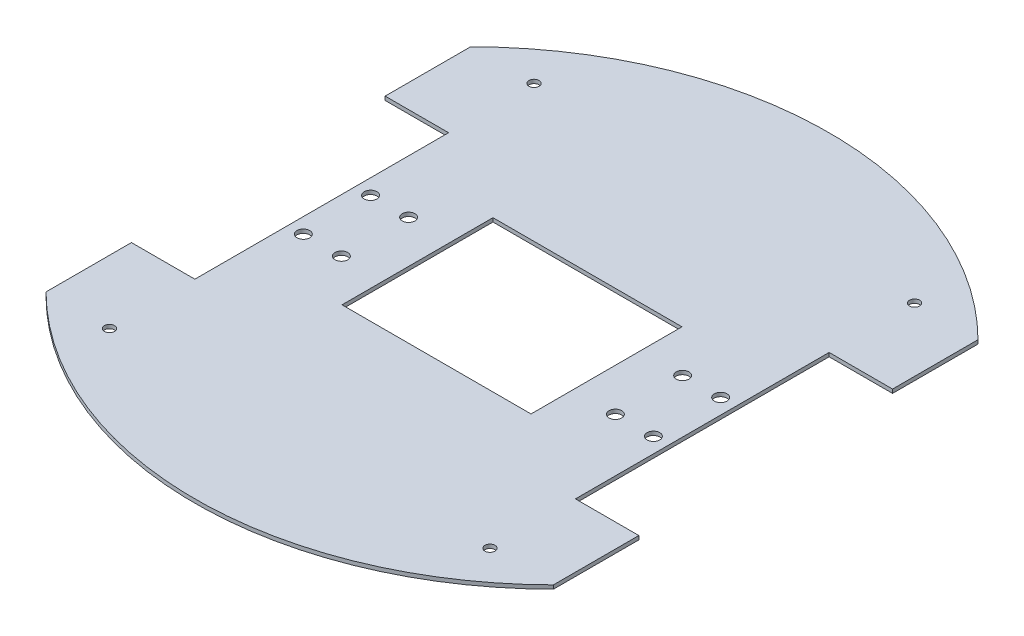
ISO-10303-21;
HEADER;
FILE_DESCRIPTION(('STEP AP214'),'2;1');
FILE_NAME('part.step','',(''),(''),'','','');
FILE_SCHEMA(('AUTOMOTIVE_DESIGN { 1 0 10303 214 1 1 1 1 }'));
ENDSEC;
DATA;
#1=APPLICATION_CONTEXT('core data for automotive mechanical design processes');
#2=APPLICATION_PROTOCOL_DEFINITION('international standard','automotive_design',2000,#1);
#3=PRODUCT_CONTEXT('',#1,'mechanical');
#4=PRODUCT('Part','Part','',(#3));
#5=PRODUCT_RELATED_PRODUCT_CATEGORY('part','',(#4));
#6=PRODUCT_DEFINITION_FORMATION('','',#4);
#7=PRODUCT_DEFINITION_CONTEXT('part definition',#1,'design');
#8=PRODUCT_DEFINITION('design','',#6,#7);
#9=PRODUCT_DEFINITION_SHAPE('','',#8);
#10=(LENGTH_UNIT() NAMED_UNIT(*) SI_UNIT(.MILLI.,.METRE.));
#11=(NAMED_UNIT(*) PLANE_ANGLE_UNIT() SI_UNIT($,.RADIAN.));
#12=(NAMED_UNIT(*) SI_UNIT($,.STERADIAN.) SOLID_ANGLE_UNIT());
#13=UNCERTAINTY_MEASURE_WITH_UNIT(LENGTH_MEASURE(1.E-05),#10,'distance_accuracy_value','');
#14=(GEOMETRIC_REPRESENTATION_CONTEXT(3) GLOBAL_UNCERTAINTY_ASSIGNED_CONTEXT((#13)) GLOBAL_UNIT_ASSIGNED_CONTEXT((#10,
#11,#12)) REPRESENTATION_CONTEXT('',''));
#15=CARTESIAN_POINT('',(0.,0.,0.));
#16=DIRECTION('',(0.,0.,1.));
#17=DIRECTION('',(1.,0.,0.));
#18=AXIS2_PLACEMENT_3D('',#15,#16,#17);
#19=CARTESIAN_POINT('',(0.,3.,-33.3333333333335));
#20=DIRECTION('',(0.,1.,0.));
#21=DIRECTION('',(0.,0.,1.));
#22=AXIS2_PLACEMENT_3D('',#19,#20,#21);
#23=PLANE('',#22);
#24=CARTESIAN_POINT('',(-138.,3.,-26.5));
#25=DIRECTION('',(0.,1.,0.));
#26=DIRECTION('',(0.,0.,1.));
#27=AXIS2_PLACEMENT_3D('',#24,#25,#26);
#28=CIRCLE('',#27,4.99999999999999);
#29=CARTESIAN_POINT('',(-138.,3.,-21.5));
#30=VERTEX_POINT('',#29);
#31=EDGE_CURVE('E426',#30,#30,#28,.F.);
#32=ORIENTED_EDGE('',*,*,#31,.T.);
#33=EDGE_LOOP('',(#32));
#34=FACE_BOUND('',#33,.T.);
#35=CARTESIAN_POINT('',(138.,3.,26.5000000000001));
#36=DIRECTION('',(0.,1.,0.));
#37=DIRECTION('',(0.,0.,1.));
#38=AXIS2_PLACEMENT_3D('',#35,#36,#37);
#39=CIRCLE('',#38,4.99999999999999);
#40=CARTESIAN_POINT('',(138.,3.,31.5000000000001));
#41=VERTEX_POINT('',#40);
#42=EDGE_CURVE('E434',#41,#41,#39,.F.);
#43=ORIENTED_EDGE('',*,*,#42,.T.);
#44=EDGE_LOOP('',(#43));
#45=FACE_BOUND('',#44,.T.);
#46=CARTESIAN_POINT('',(-138.,3.,26.5));
#47=DIRECTION('',(0.,1.,0.));
#48=DIRECTION('',(0.,0.,1.));
#49=AXIS2_PLACEMENT_3D('',#46,#47,#48);
#50=CIRCLE('',#49,4.99999999999999);
#51=CARTESIAN_POINT('',(-138.,3.,31.5));
#52=VERTEX_POINT('',#51);
#53=EDGE_CURVE('E437',#52,#52,#50,.T.);
#54=ORIENTED_EDGE('',*,*,#53,.F.);
#55=EDGE_LOOP('',(#54));
#56=FACE_BOUND('',#55,.T.);
#57=DIRECTION('',(0.,0.,1.));
#58=VECTOR('',#57,1.);
#59=CARTESIAN_POINT('',(-74.5,3.,-33.3333333333335));
#60=LINE('',#59,#58);
#61=CARTESIAN_POINT('',(-74.5,3.,-59.5));
#62=VERTEX_POINT('',#61);
#63=CARTESIAN_POINT('',(-74.5,3.,59.5));
#64=VERTEX_POINT('',#63);
#65=EDGE_CURVE('E186',#62,#64,#60,.T.);
#66=ORIENTED_EDGE('',*,*,#65,.F.);
#67=DIRECTION('',(-1.,0.,0.));
#68=VECTOR('',#67,1.);
#69=CARTESIAN_POINT('',(0.,3.,-59.5));
#70=LINE('',#69,#68);
#71=CARTESIAN_POINT('',(74.5,3.,-59.5));
#72=VERTEX_POINT('',#71);
#73=EDGE_CURVE('E179',#72,#62,#70,.T.);
#74=ORIENTED_EDGE('',*,*,#73,.F.);
#75=DIRECTION('',(0.,0.,-1.));
#76=VECTOR('',#75,1.);
#77=CARTESIAN_POINT('',(74.5,3.,-33.3333333333335));
#78=LINE('',#77,#76);
#79=CARTESIAN_POINT('',(74.5,3.,59.5));
#80=VERTEX_POINT('',#79);
#81=EDGE_CURVE('E159',#80,#72,#78,.T.);
#82=ORIENTED_EDGE('',*,*,#81,.F.);
#83=DIRECTION('',(1.,0.,0.));
#84=VECTOR('',#83,1.);
#85=CARTESIAN_POINT('',(0.,3.,59.5));
#86=LINE('',#85,#84);
#87=EDGE_CURVE('E184',#64,#80,#86,.T.);
#88=ORIENTED_EDGE('',*,*,#87,.F.);
#89=EDGE_LOOP('',(#66,#74,#82,#88));
#90=FACE_BOUND('',#89,.T.);
#91=CARTESIAN_POINT('',(-150.,3.,167.359909646538));
#92=DIRECTION('',(0.,1.,0.));
#93=DIRECTION('',(0.,0.,-1.));
#94=AXIS2_PLACEMENT_3D('',#91,#92,#93);
#95=CIRCLE('',#94,3.99999999999999);
#96=CARTESIAN_POINT('',(-150.,3.,163.359909646538));
#97=VERTEX_POINT('',#96);
#98=EDGE_CURVE('E188',#97,#97,#95,.T.);
#99=ORIENTED_EDGE('',*,*,#98,.F.);
#100=EDGE_LOOP('',(#99));
#101=FACE_BOUND('',#100,.T.);
#102=CARTESIAN_POINT('',(150.,3.,167.359909646538));
#103=DIRECTION('',(0.,1.,0.));
#104=DIRECTION('',(0.,0.,1.));
#105=AXIS2_PLACEMENT_3D('',#102,#103,#104);
#106=CIRCLE('',#105,3.99999999999999);
#107=CARTESIAN_POINT('',(150.,3.,171.359909646538));
#108=VERTEX_POINT('',#107);
#109=EDGE_CURVE('E193',#108,#108,#106,.T.);
#110=ORIENTED_EDGE('',*,*,#109,.F.);
#111=EDGE_LOOP('',(#110));
#112=FACE_BOUND('',#111,.T.);
#113=CARTESIAN_POINT('',(150.,3.,-167.359909646538));
#114=DIRECTION('',(0.,1.,0.));
#115=DIRECTION('',(0.,0.,-1.));
#116=AXIS2_PLACEMENT_3D('',#113,#114,#115);
#117=CIRCLE('',#116,3.99999999999999);
#118=CARTESIAN_POINT('',(150.,3.,-171.359909646538));
#119=VERTEX_POINT('',#118);
#120=EDGE_CURVE('E189',#119,#119,#117,.T.);
#121=ORIENTED_EDGE('',*,*,#120,.F.);
#122=EDGE_LOOP('',(#121));
#123=FACE_BOUND('',#122,.T.);
#124=CARTESIAN_POINT('',(-150.,3.,-167.359909646538));
#125=DIRECTION('',(0.,1.,0.));
#126=DIRECTION('',(0.,0.,1.));
#127=AXIS2_PLACEMENT_3D('',#124,#125,#126);
#128=CIRCLE('',#127,3.99999999999999);
#129=CARTESIAN_POINT('',(-150.,3.,-163.359909646538));
#130=VERTEX_POINT('',#129);
#131=EDGE_CURVE('E192',#130,#130,#128,.T.);
#132=ORIENTED_EDGE('',*,*,#131,.F.);
#133=EDGE_LOOP('',(#132));
#134=FACE_BOUND('',#133,.T.);
#135=DIRECTION('',(-1.,0.,0.));
#136=VECTOR('',#135,1.);
#137=CARTESIAN_POINT('',(-150.,3.,100.));
#138=LINE('',#137,#136);
#139=CARTESIAN_POINT('',(-150.,3.,100.));
#140=VERTEX_POINT('',#139);
#141=CARTESIAN_POINT('',(-200.,3.,100.));
#142=VERTEX_POINT('',#141);
#143=EDGE_CURVE('E201',#140,#142,#138,.T.);
#144=ORIENTED_EDGE('',*,*,#143,.T.);
#145=DIRECTION('',(0.,0.,1.));
#146=VECTOR('',#145,1.);
#147=CARTESIAN_POINT('',(-200.,3.,100.));
#148=LINE('',#147,#146);
#149=CARTESIAN_POINT('',(-200.,3.,167.359909646538));
#150=VERTEX_POINT('',#149);
#151=EDGE_CURVE('E204',#142,#150,#148,.T.);
#152=ORIENTED_EDGE('',*,*,#151,.T.);
#153=CARTESIAN_POINT('',(0.,3.,-33.3333333333335));
#154=DIRECTION('',(0.,1.,0.));
#155=DIRECTION('',(0.,0.,1.));
#156=AXIS2_PLACEMENT_3D('',#153,#154,#155);
#157=CIRCLE('',#156,283.333333333333);
#158=CARTESIAN_POINT('',(200.,3.,167.359909646538));
#159=VERTEX_POINT('',#158);
#160=EDGE_CURVE('E207',#150,#159,#157,.T.);
#161=ORIENTED_EDGE('',*,*,#160,.T.);
#162=DIRECTION('',(0.,0.,-1.));
#163=VECTOR('',#162,1.);
#164=CARTESIAN_POINT('',(200.,3.,100.));
#165=LINE('',#164,#163);
#166=CARTESIAN_POINT('',(200.,3.,100.));
#167=VERTEX_POINT('',#166);
#168=EDGE_CURVE('E209',#159,#167,#165,.T.);
#169=ORIENTED_EDGE('',*,*,#168,.T.);
#170=DIRECTION('',(-1.,0.,0.));
#171=VECTOR('',#170,1.);
#172=CARTESIAN_POINT('',(150.,3.,100.));
#173=LINE('',#172,#171);
#174=CARTESIAN_POINT('',(150.,3.,100.));
#175=VERTEX_POINT('',#174);
#176=EDGE_CURVE('E211',#167,#175,#173,.T.);
#177=ORIENTED_EDGE('',*,*,#176,.T.);
#178=DIRECTION('',(0.,0.,-1.));
#179=VECTOR('',#178,1.);
#180=CARTESIAN_POINT('',(150.,3.,100.));
#181=LINE('',#180,#179);
#182=CARTESIAN_POINT('',(150.,3.,-100.));
#183=VERTEX_POINT('',#182);
#184=EDGE_CURVE('E213',#175,#183,#181,.T.);
#185=ORIENTED_EDGE('',*,*,#184,.T.);
#186=DIRECTION('',(1.,0.,0.));
#187=VECTOR('',#186,1.);
#188=CARTESIAN_POINT('',(150.,3.,-100.));
#189=LINE('',#188,#187);
#190=CARTESIAN_POINT('',(200.,3.,-100.));
#191=VERTEX_POINT('',#190);
#192=EDGE_CURVE('E215',#183,#191,#189,.T.);
#193=ORIENTED_EDGE('',*,*,#192,.T.);
#194=DIRECTION('',(0.,0.,-1.));
#195=VECTOR('',#194,1.);
#196=CARTESIAN_POINT('',(200.,3.,-100.));
#197=LINE('',#196,#195);
#198=CARTESIAN_POINT('',(200.,3.,-167.359909646538));
#199=VERTEX_POINT('',#198);
#200=EDGE_CURVE('E217',#191,#199,#197,.T.);
#201=ORIENTED_EDGE('',*,*,#200,.T.);
#202=CARTESIAN_POINT('',(0.,3.,33.3333333333337));
#203=DIRECTION('',(0.,1.,0.));
#204=DIRECTION('',(0.,0.,-1.));
#205=AXIS2_PLACEMENT_3D('',#202,#203,#204);
#206=CIRCLE('',#205,283.333333333333);
#207=CARTESIAN_POINT('',(-200.,3.,-167.359909646538));
#208=VERTEX_POINT('',#207);
#209=EDGE_CURVE('E219',#199,#208,#206,.T.);
#210=ORIENTED_EDGE('',*,*,#209,.T.);
#211=DIRECTION('',(0.,0.,1.));
#212=VECTOR('',#211,1.);
#213=CARTESIAN_POINT('',(-200.,3.,-100.));
#214=LINE('',#213,#212);
#215=CARTESIAN_POINT('',(-200.,3.,-100.));
#216=VERTEX_POINT('',#215);
#217=EDGE_CURVE('E221',#208,#216,#214,.T.);
#218=ORIENTED_EDGE('',*,*,#217,.T.);
#219=DIRECTION('',(1.,0.,0.));
#220=VECTOR('',#219,1.);
#221=CARTESIAN_POINT('',(-150.,3.,-100.));
#222=LINE('',#221,#220);
#223=CARTESIAN_POINT('',(-150.,3.,-100.));
#224=VERTEX_POINT('',#223);
#225=EDGE_CURVE('E223',#216,#224,#222,.T.);
#226=ORIENTED_EDGE('',*,*,#225,.T.);
#227=DIRECTION('',(0.,0.,1.));
#228=VECTOR('',#227,1.);
#229=CARTESIAN_POINT('',(-150.,3.,-100.));
#230=LINE('',#229,#228);
#231=EDGE_CURVE('E225',#224,#140,#230,.T.);
#232=ORIENTED_EDGE('',*,*,#231,.T.);
#233=EDGE_LOOP('',(#144,#152,#161,#169,#177,#185,#193,#201,#210,#218,#226,#232));
#234=FACE_BOUND('',#233,.T.);
#235=CARTESIAN_POINT('',(138.,3.,-26.5));
#236=DIRECTION('',(0.,1.,0.));
#237=DIRECTION('',(0.,0.,1.));
#238=AXIS2_PLACEMENT_3D('',#235,#236,#237);
#239=CIRCLE('',#238,4.99999999999999);
#240=CARTESIAN_POINT('',(138.,3.,-21.5));
#241=VERTEX_POINT('',#240);
#242=EDGE_CURVE('E409',#241,#241,#239,.T.);
#243=ORIENTED_EDGE('',*,*,#242,.F.);
#244=EDGE_LOOP('',(#243));
#245=FACE_BOUND('',#244,.T.);
#246=CARTESIAN_POINT('',(108.,3.,-26.5));
#247=DIRECTION('',(0.,1.,0.));
#248=DIRECTION('',(0.,0.,1.));
#249=AXIS2_PLACEMENT_3D('',#246,#247,#248);
#250=CIRCLE('',#249,5.);
#251=CARTESIAN_POINT('',(108.,3.,-21.5));
#252=VERTEX_POINT('',#251);
#253=EDGE_CURVE('E413',#252,#252,#250,.T.);
#254=ORIENTED_EDGE('',*,*,#253,.F.);
#255=EDGE_LOOP('',(#254));
#256=FACE_BOUND('',#255,.T.);
#257=CARTESIAN_POINT('',(-108.,3.,26.5));
#258=DIRECTION('',(0.,1.,0.));
#259=DIRECTION('',(0.,0.,1.));
#260=AXIS2_PLACEMENT_3D('',#257,#258,#259);
#261=CIRCLE('',#260,5.);
#262=CARTESIAN_POINT('',(-108.,3.,31.5));
#263=VERTEX_POINT('',#262);
#264=EDGE_CURVE('E417',#263,#263,#261,.T.);
#265=ORIENTED_EDGE('',*,*,#264,.F.);
#266=EDGE_LOOP('',(#265));
#267=FACE_BOUND('',#266,.T.);
#268=CARTESIAN_POINT('',(-108.,3.,-26.5));
#269=DIRECTION('',(0.,1.,0.));
#270=DIRECTION('',(0.,0.,1.));
#271=AXIS2_PLACEMENT_3D('',#268,#269,#270);
#272=CIRCLE('',#271,5.);
#273=CARTESIAN_POINT('',(-108.,3.,-21.5));
#274=VERTEX_POINT('',#273);
#275=EDGE_CURVE('E421',#274,#274,#272,.F.);
#276=ORIENTED_EDGE('',*,*,#275,.T.);
#277=EDGE_LOOP('',(#276));
#278=FACE_BOUND('',#277,.T.);
#279=CARTESIAN_POINT('',(108.,3.,26.5000000000001));
#280=DIRECTION('',(0.,1.,0.));
#281=DIRECTION('',(0.,0.,1.));
#282=AXIS2_PLACEMENT_3D('',#279,#280,#281);
#283=CIRCLE('',#282,5.);
#284=CARTESIAN_POINT('',(108.,3.,31.5000000000001));
#285=VERTEX_POINT('',#284);
#286=EDGE_CURVE('E424',#285,#285,#283,.F.);
#287=ORIENTED_EDGE('',*,*,#286,.T.);
#288=EDGE_LOOP('',(#287));
#289=FACE_BOUND('',#288,.T.);
#290=ADVANCED_FACE('F38',(#34,#45,#56,#90,#101,#112,#123,#134,#234,#245,#256,#267,#278,#289),
#23,.T.);
#291=CARTESIAN_POINT('',(0.,0.,-33.3333333333335));
#292=DIRECTION('',(0.,1.,0.));
#293=DIRECTION('',(0.,0.,1.));
#294=AXIS2_PLACEMENT_3D('',#291,#292,#293);
#295=PLANE('',#294);
#296=CARTESIAN_POINT('',(-108.,0.,26.5));
#297=DIRECTION('',(0.,-1.,0.));
#298=DIRECTION('',(0.,0.,-1.));
#299=AXIS2_PLACEMENT_3D('',#296,#297,#298);
#300=CIRCLE('',#299,5.);
#301=CARTESIAN_POINT('',(-108.,0.,21.5));
#302=VERTEX_POINT('',#301);
#303=EDGE_CURVE('E443',#302,#302,#300,.T.);
#304=ORIENTED_EDGE('',*,*,#303,.F.);
#305=EDGE_LOOP('',(#304));
#306=FACE_BOUND('',#305,.T.);
#307=CARTESIAN_POINT('',(108.,0.,-26.5));
#308=DIRECTION('',(0.,-1.,0.));
#309=DIRECTION('',(0.,0.,-1.));
#310=AXIS2_PLACEMENT_3D('',#307,#308,#309);
#311=CIRCLE('',#310,5.);
#312=CARTESIAN_POINT('',(108.,0.,-31.5));
#313=VERTEX_POINT('',#312);
#314=EDGE_CURVE('E453',#313,#313,#311,.T.);
#315=ORIENTED_EDGE('',*,*,#314,.F.);
#316=EDGE_LOOP('',(#315));
#317=FACE_BOUND('',#316,.T.);
#318=CARTESIAN_POINT('',(138.,0.,-26.5));
#319=DIRECTION('',(0.,-1.,0.));
#320=DIRECTION('',(0.,0.,-1.));
#321=AXIS2_PLACEMENT_3D('',#318,#319,#320);
#322=CIRCLE('',#321,4.99999999999999);
#323=CARTESIAN_POINT('',(138.,0.,-31.5));
#324=VERTEX_POINT('',#323);
#325=EDGE_CURVE('E459',#324,#324,#322,.T.);
#326=ORIENTED_EDGE('',*,*,#325,.F.);
#327=EDGE_LOOP('',(#326));
#328=FACE_BOUND('',#327,.T.);
#329=CARTESIAN_POINT('',(-138.,0.,26.5));
#330=DIRECTION('',(0.,-1.,0.));
#331=DIRECTION('',(0.,0.,-1.));
#332=AXIS2_PLACEMENT_3D('',#329,#330,#331);
#333=CIRCLE('',#332,4.99999999999999);
#334=CARTESIAN_POINT('',(-138.,0.,21.5));
#335=VERTEX_POINT('',#334);
#336=EDGE_CURVE('E440',#335,#335,#333,.T.);
#337=ORIENTED_EDGE('',*,*,#336,.F.);
#338=EDGE_LOOP('',(#337));
#339=FACE_BOUND('',#338,.T.);
#340=DIRECTION('',(1.,0.,0.));
#341=VECTOR('',#340,1.);
#342=CARTESIAN_POINT('',(74.5,0.,-59.5));
#343=LINE('',#342,#341);
#344=CARTESIAN_POINT('',(-74.5,0.,-59.5));
#345=VERTEX_POINT('',#344);
#346=CARTESIAN_POINT('',(74.5,0.,-59.5));
#347=VERTEX_POINT('',#346);
#348=EDGE_CURVE('E165',#345,#347,#343,.T.);
#349=ORIENTED_EDGE('',*,*,#348,.F.);
#350=DIRECTION('',(0.,0.,-1.));
#351=VECTOR('',#350,1.);
#352=CARTESIAN_POINT('',(-74.5,0.,-59.5));
#353=LINE('',#352,#351);
#354=CARTESIAN_POINT('',(-74.5,0.,59.5));
#355=VERTEX_POINT('',#354);
#356=EDGE_CURVE('E63',#355,#345,#353,.T.);
#357=ORIENTED_EDGE('',*,*,#356,.F.);
#358=DIRECTION('',(-1.,0.,0.));
#359=VECTOR('',#358,1.);
#360=CARTESIAN_POINT('',(74.5,0.,59.5));
#361=LINE('',#360,#359);
#362=CARTESIAN_POINT('',(74.5,0.,59.5));
#363=VERTEX_POINT('',#362);
#364=EDGE_CURVE('E172',#363,#355,#361,.T.);
#365=ORIENTED_EDGE('',*,*,#364,.F.);
#366=DIRECTION('',(0.,0.,1.));
#367=VECTOR('',#366,1.);
#368=CARTESIAN_POINT('',(74.5,0.,-59.5));
#369=LINE('',#368,#367);
#370=EDGE_CURVE('E156',#347,#363,#369,.T.);
#371=ORIENTED_EDGE('',*,*,#370,.F.);
#372=EDGE_LOOP('',(#349,#357,#365,#371));
#373=FACE_BOUND('',#372,.T.);
#374=CARTESIAN_POINT('',(-150.,0.,167.359909646538));
#375=DIRECTION('',(0.,1.,0.));
#376=DIRECTION('',(0.,0.,1.));
#377=AXIS2_PLACEMENT_3D('',#374,#375,#376);
#378=CIRCLE('',#377,3.99999999999999);
#379=CARTESIAN_POINT('',(-150.,0.,171.359909646538));
#380=VERTEX_POINT('',#379);
#381=EDGE_CURVE('E42',#380,#380,#378,.T.);
#382=ORIENTED_EDGE('',*,*,#381,.T.);
#383=EDGE_LOOP('',(#382));
#384=FACE_BOUND('',#383,.T.);
#385=CARTESIAN_POINT('',(150.,0.,167.359909646538));
#386=DIRECTION('',(0.,1.,0.));
#387=DIRECTION('',(0.,0.,1.));
#388=AXIS2_PLACEMENT_3D('',#385,#386,#387);
#389=CIRCLE('',#388,3.99999999999999);
#390=CARTESIAN_POINT('',(150.,0.,171.359909646538));
#391=VERTEX_POINT('',#390);
#392=EDGE_CURVE('E287',#391,#391,#389,.T.);
#393=ORIENTED_EDGE('',*,*,#392,.T.);
#394=EDGE_LOOP('',(#393));
#395=FACE_BOUND('',#394,.T.);
#396=CARTESIAN_POINT('',(150.,0.,-167.359909646538));
#397=DIRECTION('',(0.,1.,0.));
#398=DIRECTION('',(0.,0.,1.));
#399=AXIS2_PLACEMENT_3D('',#396,#397,#398);
#400=CIRCLE('',#399,3.99999999999999);
#401=CARTESIAN_POINT('',(150.,0.,-163.359909646538));
#402=VERTEX_POINT('',#401);
#403=EDGE_CURVE('E285',#402,#402,#400,.T.);
#404=ORIENTED_EDGE('',*,*,#403,.T.);
#405=EDGE_LOOP('',(#404));
#406=FACE_BOUND('',#405,.T.);
#407=CARTESIAN_POINT('',(-150.,0.,-167.359909646538));
#408=DIRECTION('',(0.,1.,0.));
#409=DIRECTION('',(0.,0.,1.));
#410=AXIS2_PLACEMENT_3D('',#407,#408,#409);
#411=CIRCLE('',#410,3.99999999999999);
#412=CARTESIAN_POINT('',(-150.,0.,-163.359909646538));
#413=VERTEX_POINT('',#412);
#414=EDGE_CURVE('E200',#413,#413,#411,.T.);
#415=ORIENTED_EDGE('',*,*,#414,.T.);
#416=EDGE_LOOP('',(#415));
#417=FACE_BOUND('',#416,.T.);
#418=DIRECTION('',(-1.,0.,0.));
#419=VECTOR('',#418,1.);
#420=CARTESIAN_POINT('',(-150.,0.,100.));
#421=LINE('',#420,#419);
#422=CARTESIAN_POINT('',(-150.,0.,100.));
#423=VERTEX_POINT('',#422);
#424=CARTESIAN_POINT('',(-200.,0.,100.));
#425=VERTEX_POINT('',#424);
#426=EDGE_CURVE('E228',#423,#425,#421,.T.);
#427=ORIENTED_EDGE('',*,*,#426,.F.);
#428=DIRECTION('',(0.,0.,1.));
#429=VECTOR('',#428,1.);
#430=CARTESIAN_POINT('',(-150.,0.,-100.));
#431=LINE('',#430,#429);
#432=CARTESIAN_POINT('',(-150.,0.,-100.));
#433=VERTEX_POINT('',#432);
#434=EDGE_CURVE('E205',#433,#423,#431,.T.);
#435=ORIENTED_EDGE('',*,*,#434,.F.);
#436=DIRECTION('',(1.,0.,0.));
#437=VECTOR('',#436,1.);
#438=CARTESIAN_POINT('',(-150.,0.,-100.));
#439=LINE('',#438,#437);
#440=CARTESIAN_POINT('',(-200.,0.,-100.));
#441=VERTEX_POINT('',#440);
#442=EDGE_CURVE('E249',#441,#433,#439,.T.);
#443=ORIENTED_EDGE('',*,*,#442,.F.);
#444=DIRECTION('',(0.,0.,1.));
#445=VECTOR('',#444,1.);
#446=CARTESIAN_POINT('',(-200.,0.,-100.));
#447=LINE('',#446,#445);
#448=CARTESIAN_POINT('',(-200.,0.,-167.359909646538));
#449=VERTEX_POINT('',#448);
#450=EDGE_CURVE('E247',#449,#441,#447,.T.);
#451=ORIENTED_EDGE('',*,*,#450,.F.);
#452=CARTESIAN_POINT('',(0.,0.,33.3333333333337));
#453=DIRECTION('',(0.,1.,0.));
#454=DIRECTION('',(0.,0.,-1.));
#455=AXIS2_PLACEMENT_3D('',#452,#453,#454);
#456=CIRCLE('',#455,283.333333333333);
#457=CARTESIAN_POINT('',(200.,0.,-167.359909646538));
#458=VERTEX_POINT('',#457);
#459=EDGE_CURVE('E245',#458,#449,#456,.T.);
#460=ORIENTED_EDGE('',*,*,#459,.F.);
#461=DIRECTION('',(0.,0.,-1.));
#462=VECTOR('',#461,1.);
#463=CARTESIAN_POINT('',(200.,0.,-100.));
#464=LINE('',#463,#462);
#465=CARTESIAN_POINT('',(200.,0.,-100.));
#466=VERTEX_POINT('',#465);
#467=EDGE_CURVE('E243',#466,#458,#464,.T.);
#468=ORIENTED_EDGE('',*,*,#467,.F.);
#469=DIRECTION('',(1.,0.,0.));
#470=VECTOR('',#469,1.);
#471=CARTESIAN_POINT('',(150.,0.,-100.));
#472=LINE('',#471,#470);
#473=CARTESIAN_POINT('',(150.,0.,-100.));
#474=VERTEX_POINT('',#473);
#475=EDGE_CURVE('E241',#474,#466,#472,.T.);
#476=ORIENTED_EDGE('',*,*,#475,.F.);
#477=DIRECTION('',(0.,0.,-1.));
#478=VECTOR('',#477,1.);
#479=CARTESIAN_POINT('',(150.,0.,100.));
#480=LINE('',#479,#478);
#481=CARTESIAN_POINT('',(150.,0.,100.));
#482=VERTEX_POINT('',#481);
#483=EDGE_CURVE('E239',#482,#474,#480,.T.);
#484=ORIENTED_EDGE('',*,*,#483,.F.);
#485=DIRECTION('',(-1.,0.,0.));
#486=VECTOR('',#485,1.);
#487=CARTESIAN_POINT('',(150.,0.,100.));
#488=LINE('',#487,#486);
#489=CARTESIAN_POINT('',(200.,0.,100.));
#490=VERTEX_POINT('',#489);
#491=EDGE_CURVE('E237',#490,#482,#488,.T.);
#492=ORIENTED_EDGE('',*,*,#491,.F.);
#493=DIRECTION('',(0.,0.,-1.));
#494=VECTOR('',#493,1.);
#495=CARTESIAN_POINT('',(200.,0.,100.));
#496=LINE('',#495,#494);
#497=CARTESIAN_POINT('',(200.,0.,167.359909646538));
#498=VERTEX_POINT('',#497);
#499=EDGE_CURVE('E235',#498,#490,#496,.T.);
#500=ORIENTED_EDGE('',*,*,#499,.F.);
#501=CARTESIAN_POINT('',(0.,0.,-33.3333333333335));
#502=DIRECTION('',(0.,1.,0.));
#503=DIRECTION('',(0.,0.,1.));
#504=AXIS2_PLACEMENT_3D('',#501,#502,#503);
#505=CIRCLE('',#504,283.333333333333);
#506=CARTESIAN_POINT('',(-200.,0.,167.359909646538));
#507=VERTEX_POINT('',#506);
#508=EDGE_CURVE('E233',#507,#498,#505,.T.);
#509=ORIENTED_EDGE('',*,*,#508,.F.);
#510=DIRECTION('',(0.,0.,1.));
#511=VECTOR('',#510,1.);
#512=CARTESIAN_POINT('',(-200.,0.,100.));
#513=LINE('',#512,#511);
#514=EDGE_CURVE('E231',#425,#507,#513,.T.);
#515=ORIENTED_EDGE('',*,*,#514,.F.);
#516=EDGE_LOOP('',(#427,#435,#443,#451,#460,#468,#476,#484,#492,#500,#509,#515));
#517=FACE_BOUND('',#516,.T.);
#518=CARTESIAN_POINT('',(138.,0.,26.5000000000001));
#519=DIRECTION('',(0.,-1.,0.));
#520=DIRECTION('',(0.,0.,-1.));
#521=AXIS2_PLACEMENT_3D('',#518,#519,#520);
#522=CIRCLE('',#521,4.99999999999999);
#523=CARTESIAN_POINT('',(138.,0.,21.5000000000001));
#524=VERTEX_POINT('',#523);
#525=EDGE_CURVE('E456',#524,#524,#522,.F.);
#526=ORIENTED_EDGE('',*,*,#525,.T.);
#527=EDGE_LOOP('',(#526));
#528=FACE_BOUND('',#527,.T.);
#529=CARTESIAN_POINT('',(-108.,0.,-26.5));
#530=DIRECTION('',(0.,-1.,0.));
#531=DIRECTION('',(0.,0.,-1.));
#532=AXIS2_PLACEMENT_3D('',#529,#530,#531);
#533=CIRCLE('',#532,5.);
#534=CARTESIAN_POINT('',(-108.,0.,-31.5));
#535=VERTEX_POINT('',#534);
#536=EDGE_CURVE('E444',#535,#535,#533,.F.);
#537=ORIENTED_EDGE('',*,*,#536,.T.);
#538=EDGE_LOOP('',(#537));
#539=FACE_BOUND('',#538,.T.);
#540=CARTESIAN_POINT('',(-138.,0.,-26.5));
#541=DIRECTION('',(0.,-1.,0.));
#542=DIRECTION('',(0.,0.,-1.));
#543=AXIS2_PLACEMENT_3D('',#540,#541,#542);
#544=CIRCLE('',#543,4.99999999999999);
#545=CARTESIAN_POINT('',(-138.,0.,-31.5));
#546=VERTEX_POINT('',#545);
#547=EDGE_CURVE('E447',#546,#546,#544,.F.);
#548=ORIENTED_EDGE('',*,*,#547,.T.);
#549=EDGE_LOOP('',(#548));
#550=FACE_BOUND('',#549,.T.);
#551=CARTESIAN_POINT('',(108.,0.,26.5000000000001));
#552=DIRECTION('',(0.,-1.,0.));
#553=DIRECTION('',(0.,0.,-1.));
#554=AXIS2_PLACEMENT_3D('',#551,#552,#553);
#555=CIRCLE('',#554,5.);
#556=CARTESIAN_POINT('',(108.,0.,21.5000000000001));
#557=VERTEX_POINT('',#556);
#558=EDGE_CURVE('E450',#557,#557,#555,.F.);
#559=ORIENTED_EDGE('',*,*,#558,.T.);
#560=EDGE_LOOP('',(#559));
#561=FACE_BOUND('',#560,.T.);
#562=ADVANCED_FACE('F169',(#306,#317,#328,#339,#373,#384,#395,#406,#417,#517,#528,#539,#550,
#561),#295,.F.);
#563=CARTESIAN_POINT('',(-150.,3.,100.));
#564=DIRECTION('',(0.,0.,1.));
#565=DIRECTION('',(1.,0.,0.));
#566=AXIS2_PLACEMENT_3D('',#563,#564,#565);
#567=PLANE('',#566);
#568=ORIENTED_EDGE('',*,*,#426,.T.);
#569=DIRECTION('',(0.,-1.,0.));
#570=VECTOR('',#569,1.);
#571=CARTESIAN_POINT('',(-200.,3.,100.));
#572=LINE('',#571,#570);
#573=EDGE_CURVE('E12',#142,#425,#572,.T.);
#574=ORIENTED_EDGE('',*,*,#573,.F.);
#575=ORIENTED_EDGE('',*,*,#143,.F.);
#576=DIRECTION('',(0.,-1.,0.));
#577=VECTOR('',#576,1.);
#578=CARTESIAN_POINT('',(-150.,3.,100.));
#579=LINE('',#578,#577);
#580=EDGE_CURVE('E227',#140,#423,#579,.T.);
#581=ORIENTED_EDGE('',*,*,#580,.T.);
#582=EDGE_LOOP('',(#568,#574,#575,#581));
#583=FACE_BOUND('',#582,.T.);
#584=ADVANCED_FACE('F40',(#583),#567,.F.);
#585=CARTESIAN_POINT('',(-200.,3.,100.));
#586=DIRECTION('',(1.,0.,0.));
#587=DIRECTION('',(0.,0.,-1.));
#588=AXIS2_PLACEMENT_3D('',#585,#586,#587);
#589=PLANE('',#588);
#590=ORIENTED_EDGE('',*,*,#514,.T.);
#591=DIRECTION('',(0.,-1.,0.));
#592=VECTOR('',#591,1.);
#593=CARTESIAN_POINT('',(-200.,3.,167.359909646538));
#594=LINE('',#593,#592);
#595=EDGE_CURVE('E47',#150,#507,#594,.T.);
#596=ORIENTED_EDGE('',*,*,#595,.F.);
#597=ORIENTED_EDGE('',*,*,#151,.F.);
#598=ORIENTED_EDGE('',*,*,#573,.T.);
#599=EDGE_LOOP('',(#590,#596,#597,#598));
#600=FACE_BOUND('',#599,.T.);
#601=ADVANCED_FACE('F360',(#600),#589,.F.);
#602=CARTESIAN_POINT('',(0.,3.,-33.3333333333335));
#603=DIRECTION('',(0.,-1.,0.));
#604=DIRECTION('',(0.,0.,-1.));
#605=AXIS2_PLACEMENT_3D('',#602,#603,#604);
#606=CYLINDRICAL_SURFACE('',#605,283.333333333333);
#607=ORIENTED_EDGE('',*,*,#508,.T.);
#608=DIRECTION('',(0.,-1.,0.));
#609=VECTOR('',#608,1.);
#610=CARTESIAN_POINT('',(200.,3.,167.359909646538));
#611=LINE('',#610,#609);
#612=EDGE_CURVE('E278',#159,#498,#611,.T.);
#613=ORIENTED_EDGE('',*,*,#612,.F.);
#614=ORIENTED_EDGE('',*,*,#160,.F.);
#615=ORIENTED_EDGE('',*,*,#595,.T.);
#616=EDGE_LOOP('',(#607,#613,#614,#615));
#617=FACE_BOUND('',#616,.T.);
#618=ADVANCED_FACE('F357',(#617),#606,.T.);
#619=CARTESIAN_POINT('',(200.,3.,100.));
#620=DIRECTION('',(-1.,0.,0.));
#621=DIRECTION('',(0.,0.,1.));
#622=AXIS2_PLACEMENT_3D('',#619,#620,#621);
#623=PLANE('',#622);
#624=ORIENTED_EDGE('',*,*,#499,.T.);
#625=DIRECTION('',(0.,-1.,0.));
#626=VECTOR('',#625,1.);
#627=CARTESIAN_POINT('',(200.,3.,100.));
#628=LINE('',#627,#626);
#629=EDGE_CURVE('E275',#167,#490,#628,.T.);
#630=ORIENTED_EDGE('',*,*,#629,.F.);
#631=ORIENTED_EDGE('',*,*,#168,.F.);
#632=ORIENTED_EDGE('',*,*,#612,.T.);
#633=EDGE_LOOP('',(#624,#630,#631,#632));
#634=FACE_BOUND('',#633,.T.);
#635=ADVANCED_FACE('F353',(#634),#623,.F.);
#636=CARTESIAN_POINT('',(150.,3.,100.));
#637=DIRECTION('',(0.,0.,1.));
#638=DIRECTION('',(1.,0.,0.));
#639=AXIS2_PLACEMENT_3D('',#636,#637,#638);
#640=PLANE('',#639);
#641=ORIENTED_EDGE('',*,*,#491,.T.);
#642=DIRECTION('',(0.,-1.,0.));
#643=VECTOR('',#642,1.);
#644=CARTESIAN_POINT('',(150.,3.,100.));
#645=LINE('',#644,#643);
#646=EDGE_CURVE('E272',#175,#482,#645,.T.);
#647=ORIENTED_EDGE('',*,*,#646,.F.);
#648=ORIENTED_EDGE('',*,*,#176,.F.);
#649=ORIENTED_EDGE('',*,*,#629,.T.);
#650=EDGE_LOOP('',(#641,#647,#648,#649));
#651=FACE_BOUND('',#650,.T.);
#652=ADVANCED_FACE('F349',(#651),#640,.F.);
#653=CARTESIAN_POINT('',(150.,3.,100.));
#654=DIRECTION('',(-1.,0.,0.));
#655=DIRECTION('',(0.,0.,1.));
#656=AXIS2_PLACEMENT_3D('',#653,#654,#655);
#657=PLANE('',#656);
#658=ORIENTED_EDGE('',*,*,#483,.T.);
#659=DIRECTION('',(0.,-1.,0.));
#660=VECTOR('',#659,1.);
#661=CARTESIAN_POINT('',(150.,3.,-100.));
#662=LINE('',#661,#660);
#663=EDGE_CURVE('E269',#183,#474,#662,.T.);
#664=ORIENTED_EDGE('',*,*,#663,.F.);
#665=ORIENTED_EDGE('',*,*,#184,.F.);
#666=ORIENTED_EDGE('',*,*,#646,.T.);
#667=EDGE_LOOP('',(#658,#664,#665,#666));
#668=FACE_BOUND('',#667,.T.);
#669=ADVANCED_FACE('F345',(#668),#657,.F.);
#670=CARTESIAN_POINT('',(150.,3.,-100.));
#671=DIRECTION('',(0.,0.,-1.));
#672=DIRECTION('',(-1.,0.,0.));
#673=AXIS2_PLACEMENT_3D('',#670,#671,#672);
#674=PLANE('',#673);
#675=ORIENTED_EDGE('',*,*,#475,.T.);
#676=DIRECTION('',(0.,-1.,0.));
#677=VECTOR('',#676,1.);
#678=CARTESIAN_POINT('',(200.,3.,-100.));
#679=LINE('',#678,#677);
#680=EDGE_CURVE('E266',#191,#466,#679,.T.);
#681=ORIENTED_EDGE('',*,*,#680,.F.);
#682=ORIENTED_EDGE('',*,*,#192,.F.);
#683=ORIENTED_EDGE('',*,*,#663,.T.);
#684=EDGE_LOOP('',(#675,#681,#682,#683));
#685=FACE_BOUND('',#684,.T.);
#686=ADVANCED_FACE('F341',(#685),#674,.F.);
#687=CARTESIAN_POINT('',(200.,3.,-100.));
#688=DIRECTION('',(-1.,0.,0.));
#689=DIRECTION('',(0.,0.,1.));
#690=AXIS2_PLACEMENT_3D('',#687,#688,#689);
#691=PLANE('',#690);
#692=ORIENTED_EDGE('',*,*,#467,.T.);
#693=DIRECTION('',(0.,-1.,0.));
#694=VECTOR('',#693,1.);
#695=CARTESIAN_POINT('',(200.,3.,-167.359909646538));
#696=LINE('',#695,#694);
#697=EDGE_CURVE('E263',#199,#458,#696,.T.);
#698=ORIENTED_EDGE('',*,*,#697,.F.);
#699=ORIENTED_EDGE('',*,*,#200,.F.);
#700=ORIENTED_EDGE('',*,*,#680,.T.);
#701=EDGE_LOOP('',(#692,#698,#699,#700));
#702=FACE_BOUND('',#701,.T.);
#703=ADVANCED_FACE('F337',(#702),#691,.F.);
#704=CARTESIAN_POINT('',(0.,3.,33.3333333333337));
#705=DIRECTION('',(0.,-1.,0.));
#706=DIRECTION('',(0.,0.,-1.));
#707=AXIS2_PLACEMENT_3D('',#704,#705,#706);
#708=CYLINDRICAL_SURFACE('',#707,283.333333333333);
#709=ORIENTED_EDGE('',*,*,#459,.T.);
#710=DIRECTION('',(0.,-1.,0.));
#711=VECTOR('',#710,1.);
#712=CARTESIAN_POINT('',(-200.,3.,-167.359909646538));
#713=LINE('',#712,#711);
#714=EDGE_CURVE('E260',#208,#449,#713,.T.);
#715=ORIENTED_EDGE('',*,*,#714,.F.);
#716=ORIENTED_EDGE('',*,*,#209,.F.);
#717=ORIENTED_EDGE('',*,*,#697,.T.);
#718=EDGE_LOOP('',(#709,#715,#716,#717));
#719=FACE_BOUND('',#718,.T.);
#720=ADVANCED_FACE('F333',(#719),#708,.T.);
#721=CARTESIAN_POINT('',(-200.,3.,-100.));
#722=DIRECTION('',(1.,0.,0.));
#723=DIRECTION('',(0.,0.,-1.));
#724=AXIS2_PLACEMENT_3D('',#721,#722,#723);
#725=PLANE('',#724);
#726=ORIENTED_EDGE('',*,*,#450,.T.);
#727=DIRECTION('',(0.,-1.,0.));
#728=VECTOR('',#727,1.);
#729=CARTESIAN_POINT('',(-200.,3.,-100.));
#730=LINE('',#729,#728);
#731=EDGE_CURVE('E257',#216,#441,#730,.T.);
#732=ORIENTED_EDGE('',*,*,#731,.F.);
#733=ORIENTED_EDGE('',*,*,#217,.F.);
#734=ORIENTED_EDGE('',*,*,#714,.T.);
#735=EDGE_LOOP('',(#726,#732,#733,#734));
#736=FACE_BOUND('',#735,.T.);
#737=ADVANCED_FACE('F329',(#736),#725,.F.);
#738=CARTESIAN_POINT('',(-150.,3.,-100.));
#739=DIRECTION('',(0.,0.,-1.));
#740=DIRECTION('',(-1.,0.,0.));
#741=AXIS2_PLACEMENT_3D('',#738,#739,#740);
#742=PLANE('',#741);
#743=ORIENTED_EDGE('',*,*,#442,.T.);
#744=DIRECTION('',(0.,-1.,0.));
#745=VECTOR('',#744,1.);
#746=CARTESIAN_POINT('',(-150.,3.,-100.));
#747=LINE('',#746,#745);
#748=EDGE_CURVE('E254',#224,#433,#747,.T.);
#749=ORIENTED_EDGE('',*,*,#748,.F.);
#750=ORIENTED_EDGE('',*,*,#225,.F.);
#751=ORIENTED_EDGE('',*,*,#731,.T.);
#752=EDGE_LOOP('',(#743,#749,#750,#751));
#753=FACE_BOUND('',#752,.T.);
#754=ADVANCED_FACE('F325',(#753),#742,.F.);
#755=CARTESIAN_POINT('',(-150.,3.,-100.));
#756=DIRECTION('',(1.,0.,0.));
#757=DIRECTION('',(0.,0.,-1.));
#758=AXIS2_PLACEMENT_3D('',#755,#756,#757);
#759=PLANE('',#758);
#760=ORIENTED_EDGE('',*,*,#434,.T.);
#761=ORIENTED_EDGE('',*,*,#580,.F.);
#762=ORIENTED_EDGE('',*,*,#231,.F.);
#763=ORIENTED_EDGE('',*,*,#748,.T.);
#764=EDGE_LOOP('',(#760,#761,#762,#763));
#765=FACE_BOUND('',#764,.T.);
#766=ADVANCED_FACE('F322',(#765),#759,.F.);
#767=CARTESIAN_POINT('',(-150.,-7.,-167.359909646538));
#768=DIRECTION('',(0.,1.,0.));
#769=DIRECTION('',(0.,0.,1.));
#770=AXIS2_PLACEMENT_3D('',#767,#768,#769);
#771=CYLINDRICAL_SURFACE('',#770,3.99999999999999);
#772=ORIENTED_EDGE('',*,*,#131,.T.);
#773=EDGE_LOOP('',(#772));
#774=FACE_BOUND('',#773,.T.);
#775=ORIENTED_EDGE('',*,*,#414,.F.);
#776=EDGE_LOOP('',(#775));
#777=FACE_BOUND('',#776,.T.);
#778=ADVANCED_FACE('F320',(#774,#777),#771,.F.);
#779=CARTESIAN_POINT('',(150.,-7.,-167.359909646538));
#780=DIRECTION('',(0.,1.,0.));
#781=DIRECTION('',(0.,0.,1.));
#782=AXIS2_PLACEMENT_3D('',#779,#780,#781);
#783=CYLINDRICAL_SURFACE('',#782,3.99999999999999);
#784=ORIENTED_EDGE('',*,*,#120,.T.);
#785=EDGE_LOOP('',(#784));
#786=FACE_BOUND('',#785,.T.);
#787=ORIENTED_EDGE('',*,*,#403,.F.);
#788=EDGE_LOOP('',(#787));
#789=FACE_BOUND('',#788,.T.);
#790=ADVANCED_FACE('F306',(#786,#789),#783,.F.);
#791=CARTESIAN_POINT('',(150.,-7.,167.359909646538));
#792=DIRECTION('',(0.,1.,0.));
#793=DIRECTION('',(0.,0.,1.));
#794=AXIS2_PLACEMENT_3D('',#791,#792,#793);
#795=CYLINDRICAL_SURFACE('',#794,3.99999999999999);
#796=ORIENTED_EDGE('',*,*,#109,.T.);
#797=EDGE_LOOP('',(#796));
#798=FACE_BOUND('',#797,.T.);
#799=ORIENTED_EDGE('',*,*,#392,.F.);
#800=EDGE_LOOP('',(#799));
#801=FACE_BOUND('',#800,.T.);
#802=ADVANCED_FACE('F297',(#798,#801),#795,.F.);
#803=CARTESIAN_POINT('',(-150.,-7.,167.359909646538));
#804=DIRECTION('',(0.,1.,0.));
#805=DIRECTION('',(0.,0.,1.));
#806=AXIS2_PLACEMENT_3D('',#803,#804,#805);
#807=CYLINDRICAL_SURFACE('',#806,3.99999999999999);
#808=ORIENTED_EDGE('',*,*,#98,.T.);
#809=EDGE_LOOP('',(#808));
#810=FACE_BOUND('',#809,.T.);
#811=ORIENTED_EDGE('',*,*,#381,.F.);
#812=EDGE_LOOP('',(#811));
#813=FACE_BOUND('',#812,.T.);
#814=ADVANCED_FACE('F294',(#810,#813),#807,.F.);
#815=CARTESIAN_POINT('',(-74.5,10.,-59.5));
#816=DIRECTION('',(-1.,0.,0.));
#817=DIRECTION('',(0.,0.,1.));
#818=AXIS2_PLACEMENT_3D('',#815,#816,#817);
#819=PLANE('',#818);
#820=ORIENTED_EDGE('',*,*,#65,.T.);
#821=DIRECTION('',(0.,-1.,0.));
#822=VECTOR('',#821,1.);
#823=CARTESIAN_POINT('',(-74.5,10.,59.5));
#824=LINE('',#823,#822);
#825=EDGE_CURVE('E177',#64,#355,#824,.T.);
#826=ORIENTED_EDGE('',*,*,#825,.T.);
#827=ORIENTED_EDGE('',*,*,#356,.T.);
#828=DIRECTION('',(0.,-1.,0.));
#829=VECTOR('',#828,1.);
#830=CARTESIAN_POINT('',(-74.5,10.,-59.5));
#831=LINE('',#830,#829);
#832=EDGE_CURVE('E162',#62,#345,#831,.T.);
#833=ORIENTED_EDGE('',*,*,#832,.F.);
#834=EDGE_LOOP('',(#820,#826,#827,#833));
#835=FACE_BOUND('',#834,.T.);
#836=ADVANCED_FACE('F296',(#835),#819,.F.);
#837=CARTESIAN_POINT('',(74.5,10.,59.5));
#838=DIRECTION('',(0.,0.,1.));
#839=DIRECTION('',(1.,0.,0.));
#840=AXIS2_PLACEMENT_3D('',#837,#838,#839);
#841=PLANE('',#840);
#842=ORIENTED_EDGE('',*,*,#87,.T.);
#843=DIRECTION('',(0.,-1.,0.));
#844=VECTOR('',#843,1.);
#845=CARTESIAN_POINT('',(74.5,10.,59.5));
#846=LINE('',#845,#844);
#847=EDGE_CURVE('E161',#80,#363,#846,.T.);
#848=ORIENTED_EDGE('',*,*,#847,.T.);
#849=ORIENTED_EDGE('',*,*,#364,.T.);
#850=ORIENTED_EDGE('',*,*,#825,.F.);
#851=EDGE_LOOP('',(#842,#848,#849,#850));
#852=FACE_BOUND('',#851,.T.);
#853=ADVANCED_FACE('F304',(#852),#841,.F.);
#854=CARTESIAN_POINT('',(74.5,10.,-59.5));
#855=DIRECTION('',(1.,0.,0.));
#856=DIRECTION('',(0.,0.,-1.));
#857=AXIS2_PLACEMENT_3D('',#854,#855,#856);
#858=PLANE('',#857);
#859=ORIENTED_EDGE('',*,*,#81,.T.);
#860=DIRECTION('',(0.,-1.,0.));
#861=VECTOR('',#860,1.);
#862=CARTESIAN_POINT('',(74.5,10.,-59.5));
#863=LINE('',#862,#861);
#864=EDGE_CURVE('E55',#72,#347,#863,.T.);
#865=ORIENTED_EDGE('',*,*,#864,.T.);
#866=ORIENTED_EDGE('',*,*,#370,.T.);
#867=ORIENTED_EDGE('',*,*,#847,.F.);
#868=EDGE_LOOP('',(#859,#865,#866,#867));
#869=FACE_BOUND('',#868,.T.);
#870=ADVANCED_FACE('F153',(#869),#858,.F.);
#871=CARTESIAN_POINT('',(74.5,10.,-59.5));
#872=DIRECTION('',(0.,0.,-1.));
#873=DIRECTION('',(-1.,0.,0.));
#874=AXIS2_PLACEMENT_3D('',#871,#872,#873);
#875=PLANE('',#874);
#876=ORIENTED_EDGE('',*,*,#73,.T.);
#877=ORIENTED_EDGE('',*,*,#832,.T.);
#878=ORIENTED_EDGE('',*,*,#348,.T.);
#879=ORIENTED_EDGE('',*,*,#864,.F.);
#880=EDGE_LOOP('',(#876,#877,#878,#879));
#881=FACE_BOUND('',#880,.T.);
#882=ADVANCED_FACE('F166',(#881),#875,.F.);
#883=CARTESIAN_POINT('',(-138.,10.,26.5));
#884=DIRECTION('',(0.,-1.,0.));
#885=DIRECTION('',(0.,0.,-1.));
#886=AXIS2_PLACEMENT_3D('',#883,#884,#885);
#887=CYLINDRICAL_SURFACE('',#886,4.99999999999999);
#888=ORIENTED_EDGE('',*,*,#53,.T.);
#889=EDGE_LOOP('',(#888));
#890=FACE_BOUND('',#889,.T.);
#891=ORIENTED_EDGE('',*,*,#336,.T.);
#892=EDGE_LOOP('',(#891));
#893=FACE_BOUND('',#892,.T.);
#894=ADVANCED_FACE('F472',(#890,#893),#887,.F.);
#895=CARTESIAN_POINT('',(138.,10.,26.5000000000001));
#896=DIRECTION('',(0.,-1.,0.));
#897=DIRECTION('',(0.,0.,-1.));
#898=AXIS2_PLACEMENT_3D('',#895,#896,#897);
#899=CYLINDRICAL_SURFACE('',#898,4.99999999999999);
#900=ORIENTED_EDGE('',*,*,#42,.F.);
#901=EDGE_LOOP('',(#900));
#902=FACE_BOUND('',#901,.T.);
#903=ORIENTED_EDGE('',*,*,#525,.F.);
#904=EDGE_LOOP('',(#903));
#905=FACE_BOUND('',#904,.T.);
#906=ADVANCED_FACE('F474',(#902,#905),#899,.F.);
#907=CARTESIAN_POINT('',(138.,10.,-26.5));
#908=DIRECTION('',(0.,-1.,0.));
#909=DIRECTION('',(0.,0.,-1.));
#910=AXIS2_PLACEMENT_3D('',#907,#908,#909);
#911=CYLINDRICAL_SURFACE('',#910,4.99999999999999);
#912=ORIENTED_EDGE('',*,*,#242,.T.);
#913=EDGE_LOOP('',(#912));
#914=FACE_BOUND('',#913,.T.);
#915=ORIENTED_EDGE('',*,*,#325,.T.);
#916=EDGE_LOOP('',(#915));
#917=FACE_BOUND('',#916,.T.);
#918=ADVANCED_FACE('F481',(#914,#917),#911,.F.);
#919=CARTESIAN_POINT('',(108.,10.,-26.5));
#920=DIRECTION('',(0.,-1.,0.));
#921=DIRECTION('',(0.,0.,-1.));
#922=AXIS2_PLACEMENT_3D('',#919,#920,#921);
#923=CYLINDRICAL_SURFACE('',#922,5.);
#924=ORIENTED_EDGE('',*,*,#253,.T.);
#925=EDGE_LOOP('',(#924));
#926=FACE_BOUND('',#925,.T.);
#927=ORIENTED_EDGE('',*,*,#314,.T.);
#928=EDGE_LOOP('',(#927));
#929=FACE_BOUND('',#928,.T.);
#930=ADVANCED_FACE('F465',(#926,#929),#923,.F.);
#931=CARTESIAN_POINT('',(-108.,10.,26.5));
#932=DIRECTION('',(0.,-1.,0.));
#933=DIRECTION('',(0.,0.,-1.));
#934=AXIS2_PLACEMENT_3D('',#931,#932,#933);
#935=CYLINDRICAL_SURFACE('',#934,5.);
#936=ORIENTED_EDGE('',*,*,#264,.T.);
#937=EDGE_LOOP('',(#936));
#938=FACE_BOUND('',#937,.T.);
#939=ORIENTED_EDGE('',*,*,#303,.T.);
#940=EDGE_LOOP('',(#939));
#941=FACE_BOUND('',#940,.T.);
#942=ADVANCED_FACE('F600',(#938,#941),#935,.F.);
#943=CARTESIAN_POINT('',(-108.,10.,-26.5));
#944=DIRECTION('',(0.,-1.,0.));
#945=DIRECTION('',(0.,0.,-1.));
#946=AXIS2_PLACEMENT_3D('',#943,#944,#945);
#947=CYLINDRICAL_SURFACE('',#946,5.);
#948=ORIENTED_EDGE('',*,*,#275,.F.);
#949=EDGE_LOOP('',(#948));
#950=FACE_BOUND('',#949,.T.);
#951=ORIENTED_EDGE('',*,*,#536,.F.);
#952=EDGE_LOOP('',(#951));
#953=FACE_BOUND('',#952,.T.);
#954=ADVANCED_FACE('F487',(#950,#953),#947,.F.);
#955=CARTESIAN_POINT('',(-138.,10.,-26.5));
#956=DIRECTION('',(0.,-1.,0.));
#957=DIRECTION('',(0.,0.,-1.));
#958=AXIS2_PLACEMENT_3D('',#955,#956,#957);
#959=CYLINDRICAL_SURFACE('',#958,4.99999999999999);
#960=ORIENTED_EDGE('',*,*,#31,.F.);
#961=EDGE_LOOP('',(#960));
#962=FACE_BOUND('',#961,.T.);
#963=ORIENTED_EDGE('',*,*,#547,.F.);
#964=EDGE_LOOP('',(#963));
#965=FACE_BOUND('',#964,.T.);
#966=ADVANCED_FACE('F618',(#962,#965),#959,.F.);
#967=CARTESIAN_POINT('',(108.,10.,26.5000000000001));
#968=DIRECTION('',(0.,-1.,0.));
#969=DIRECTION('',(0.,0.,-1.));
#970=AXIS2_PLACEMENT_3D('',#967,#968,#969);
#971=CYLINDRICAL_SURFACE('',#970,5.);
#972=ORIENTED_EDGE('',*,*,#286,.F.);
#973=EDGE_LOOP('',(#972));
#974=FACE_BOUND('',#973,.T.);
#975=ORIENTED_EDGE('',*,*,#558,.F.);
#976=EDGE_LOOP('',(#975));
#977=FACE_BOUND('',#976,.T.);
#978=ADVANCED_FACE('F628',(#974,#977),#971,.F.);
#979=CLOSED_SHELL('',(#290,#562,#584,#601,#618,#635,#652,#669,#686,#703,#720,#737,#754,#766,
#778,#790,#802,#814,#836,#853,#870,#882,#894,#906,#918,#930,#942,#954,#966,#978));
#980=MANIFOLD_SOLID_BREP('B2',#979);
#981=ADVANCED_BREP_SHAPE_REPRESENTATION('',(#18,#980),#14);
#982=SHAPE_DEFINITION_REPRESENTATION(#9,#981);
ENDSEC;
END-ISO-10303-21;
